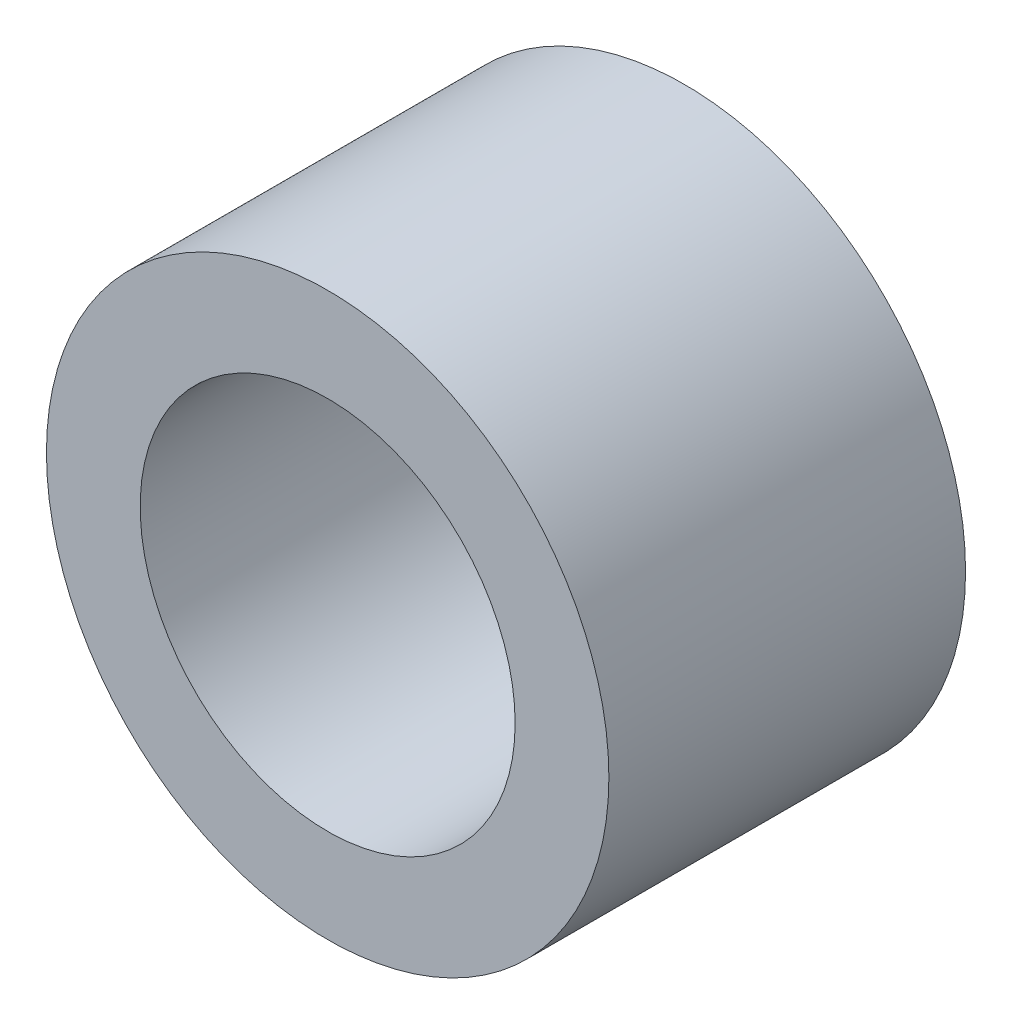
ISO-10303-21;
HEADER;
FILE_DESCRIPTION(('STEP AP214'),'2;1');
FILE_NAME('part.step','',(''),(''),'','','');
FILE_SCHEMA(('AUTOMOTIVE_DESIGN { 1 0 10303 214 1 1 1 1 }'));
ENDSEC;
DATA;
#1=APPLICATION_CONTEXT('core data for automotive mechanical design processes');
#2=APPLICATION_PROTOCOL_DEFINITION('international standard','automotive_design',2000,#1);
#3=PRODUCT_CONTEXT('',#1,'mechanical');
#4=PRODUCT('Part','Part','',(#3));
#5=PRODUCT_RELATED_PRODUCT_CATEGORY('part','',(#4));
#6=PRODUCT_DEFINITION_FORMATION('','',#4);
#7=PRODUCT_DEFINITION_CONTEXT('part definition',#1,'design');
#8=PRODUCT_DEFINITION('design','',#6,#7);
#9=PRODUCT_DEFINITION_SHAPE('','',#8);
#10=(LENGTH_UNIT() NAMED_UNIT(*) SI_UNIT(.MILLI.,.METRE.));
#11=(NAMED_UNIT(*) PLANE_ANGLE_UNIT() SI_UNIT($,.RADIAN.));
#12=(NAMED_UNIT(*) SI_UNIT($,.STERADIAN.) SOLID_ANGLE_UNIT());
#13=UNCERTAINTY_MEASURE_WITH_UNIT(LENGTH_MEASURE(1.E-05),#10,'distance_accuracy_value','');
#14=(GEOMETRIC_REPRESENTATION_CONTEXT(3) GLOBAL_UNCERTAINTY_ASSIGNED_CONTEXT((#13)) GLOBAL_UNIT_ASSIGNED_CONTEXT((#10,
#11,#12)) REPRESENTATION_CONTEXT('',''));
#15=CARTESIAN_POINT('',(0.,0.,0.));
#16=DIRECTION('',(0.,0.,1.));
#17=DIRECTION('',(1.,0.,0.));
#18=AXIS2_PLACEMENT_3D('',#15,#16,#17);
#19=CARTESIAN_POINT('',(0.,57.15,4.8321722));
#20=DIRECTION('',(0.,0.,-1.));
#21=DIRECTION('',(-1.,0.,0.));
#22=AXIS2_PLACEMENT_3D('',#19,#20,#21);
#23=CYLINDRICAL_SURFACE('',#22,2.54);
#24=CARTESIAN_POINT('',(0.,57.15,4.8321722));
#25=DIRECTION('',(0.,0.,1.));
#26=DIRECTION('',(1.,0.,0.));
#27=AXIS2_PLACEMENT_3D('',#24,#25,#26);
#28=CIRCLE('',#27,2.54);
#29=CARTESIAN_POINT('',(2.54,57.15,4.8321722));
#30=VERTEX_POINT('',#29);
#31=EDGE_CURVE('E22',#30,#30,#28,.T.);
#32=ORIENTED_EDGE('',*,*,#31,.T.);
#33=EDGE_LOOP('',(#32));
#34=FACE_BOUND('',#33,.T.);
#35=CARTESIAN_POINT('',(0.,57.15,0.));
#36=DIRECTION('',(0.,0.,1.));
#37=DIRECTION('',(1.,0.,0.));
#38=AXIS2_PLACEMENT_3D('',#35,#36,#37);
#39=CIRCLE('',#38,2.54);
#40=CARTESIAN_POINT('',(2.54,57.15,0.));
#41=VERTEX_POINT('',#40);
#42=EDGE_CURVE('E28',#41,#41,#39,.T.);
#43=ORIENTED_EDGE('',*,*,#42,.F.);
#44=EDGE_LOOP('',(#43));
#45=FACE_BOUND('',#44,.T.);
#46=ADVANCED_FACE('F15',(#34,#45),#23,.F.);
#47=CARTESIAN_POINT('',(0.,57.15,4.8321722));
#48=DIRECTION('',(0.,0.,-1.));
#49=DIRECTION('',(-1.,0.,0.));
#50=AXIS2_PLACEMENT_3D('',#47,#48,#49);
#51=CYLINDRICAL_SURFACE('',#50,3.81);
#52=CARTESIAN_POINT('',(0.,57.15,4.8321722));
#53=DIRECTION('',(0.,0.,1.));
#54=DIRECTION('',(1.,0.,0.));
#55=AXIS2_PLACEMENT_3D('',#52,#53,#54);
#56=CIRCLE('',#55,3.81);
#57=CARTESIAN_POINT('',(3.81,57.15,4.8321722));
#58=VERTEX_POINT('',#57);
#59=EDGE_CURVE('E10',#58,#58,#56,.T.);
#60=ORIENTED_EDGE('',*,*,#59,.F.);
#61=EDGE_LOOP('',(#60));
#62=FACE_BOUND('',#61,.T.);
#63=CARTESIAN_POINT('',(0.,57.15,0.));
#64=DIRECTION('',(0.,0.,1.));
#65=DIRECTION('',(1.,0.,0.));
#66=AXIS2_PLACEMENT_3D('',#63,#64,#65);
#67=CIRCLE('',#66,3.81);
#68=CARTESIAN_POINT('',(3.81,57.15,0.));
#69=VERTEX_POINT('',#68);
#70=EDGE_CURVE('E18',#69,#69,#67,.T.);
#71=ORIENTED_EDGE('',*,*,#70,.T.);
#72=EDGE_LOOP('',(#71));
#73=FACE_BOUND('',#72,.T.);
#74=ADVANCED_FACE('F35',(#62,#73),#51,.T.);
#75=CARTESIAN_POINT('',(0.,47.625,4.8321722));
#76=DIRECTION('',(0.,0.,1.));
#77=DIRECTION('',(1.,0.,0.));
#78=AXIS2_PLACEMENT_3D('',#75,#76,#77);
#79=PLANE('',#78);
#80=ORIENTED_EDGE('',*,*,#31,.F.);
#81=EDGE_LOOP('',(#80));
#82=FACE_BOUND('',#81,.T.);
#83=ORIENTED_EDGE('',*,*,#59,.T.);
#84=EDGE_LOOP('',(#83));
#85=FACE_BOUND('',#84,.T.);
#86=ADVANCED_FACE('F39',(#82,#85),#79,.T.);
#87=CARTESIAN_POINT('',(0.,47.625,0.));
#88=DIRECTION('',(0.,0.,1.));
#89=DIRECTION('',(1.,0.,0.));
#90=AXIS2_PLACEMENT_3D('',#87,#88,#89);
#91=PLANE('',#90);
#92=ORIENTED_EDGE('',*,*,#42,.T.);
#93=EDGE_LOOP('',(#92));
#94=FACE_BOUND('',#93,.T.);
#95=ORIENTED_EDGE('',*,*,#70,.F.);
#96=EDGE_LOOP('',(#95));
#97=FACE_BOUND('',#96,.T.);
#98=ADVANCED_FACE('F37',(#94,#97),#91,.F.);
#99=CLOSED_SHELL('',(#46,#74,#86,#98));
#100=MANIFOLD_SOLID_BREP('B1',#99);
#101=ADVANCED_BREP_SHAPE_REPRESENTATION('',(#18,#100),#14);
#102=SHAPE_DEFINITION_REPRESENTATION(#9,#101);
ENDSEC;
END-ISO-10303-21;
